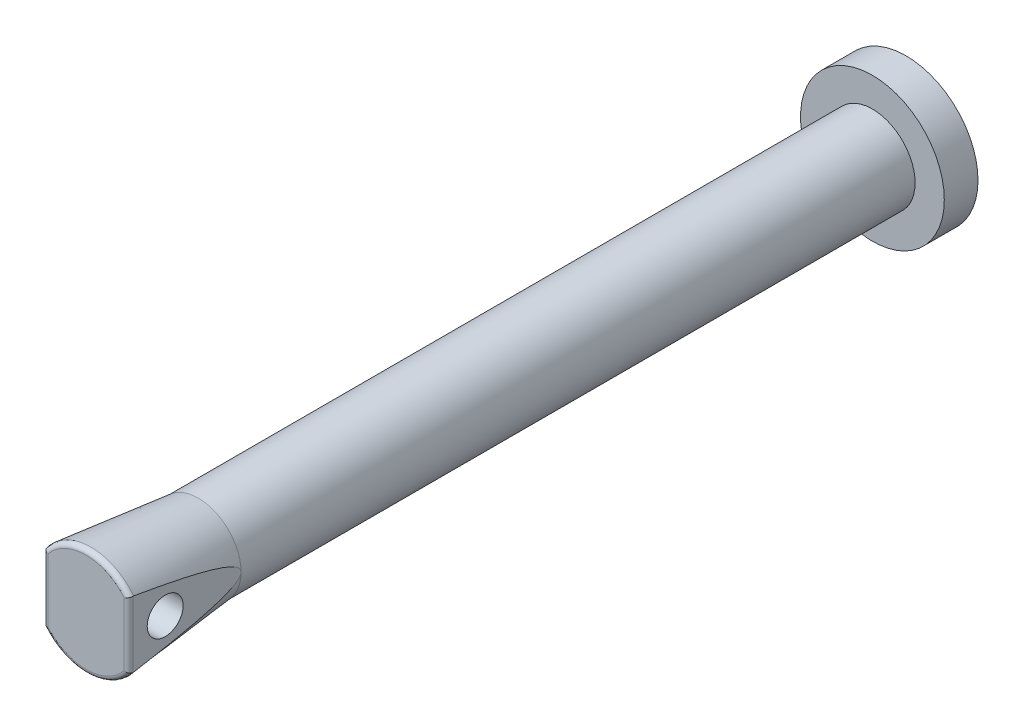
ISO-10303-21;
HEADER;
FILE_DESCRIPTION(('STEP AP214'),'2;1');
FILE_NAME('part.step','',(''),(''),'','','');
FILE_SCHEMA(('AUTOMOTIVE_DESIGN { 1 0 10303 214 1 1 1 1 }'));
ENDSEC;
DATA;
#1=APPLICATION_CONTEXT('core data for automotive mechanical design processes');
#2=APPLICATION_PROTOCOL_DEFINITION('international standard','automotive_design',2000,#1);
#3=PRODUCT_CONTEXT('',#1,'mechanical');
#4=PRODUCT('Part','Part','',(#3));
#5=PRODUCT_RELATED_PRODUCT_CATEGORY('part','',(#4));
#6=PRODUCT_DEFINITION_FORMATION('','',#4);
#7=PRODUCT_DEFINITION_CONTEXT('part definition',#1,'design');
#8=PRODUCT_DEFINITION('design','',#6,#7);
#9=PRODUCT_DEFINITION_SHAPE('','',#8);
#10=(LENGTH_UNIT() NAMED_UNIT(*) SI_UNIT(.MILLI.,.METRE.));
#11=(NAMED_UNIT(*) PLANE_ANGLE_UNIT() SI_UNIT($,.RADIAN.));
#12=(NAMED_UNIT(*) SI_UNIT($,.STERADIAN.) SOLID_ANGLE_UNIT());
#13=UNCERTAINTY_MEASURE_WITH_UNIT(LENGTH_MEASURE(1.E-05),#10,'distance_accuracy_value','');
#14=(GEOMETRIC_REPRESENTATION_CONTEXT(3) GLOBAL_UNCERTAINTY_ASSIGNED_CONTEXT((#13)) GLOBAL_UNIT_ASSIGNED_CONTEXT((#10,
#11,#12)) REPRESENTATION_CONTEXT('',''));
#15=CARTESIAN_POINT('',(0.,0.,0.));
#16=DIRECTION('',(0.,0.,1.));
#17=DIRECTION('',(1.,0.,0.));
#18=AXIS2_PLACEMENT_3D('',#15,#16,#17);
#19=CARTESIAN_POINT('',(0.,0.,31.5));
#20=DIRECTION('',(0.,0.,1.));
#21=DIRECTION('',(1.,0.,0.));
#22=AXIS2_PLACEMENT_3D('',#19,#20,#21);
#23=CONICAL_SURFACE('',#22,1.9,0.10471975511966);
#24=CARTESIAN_POINT('',(-1.9,-3.11871942863901,48.1682636303631));
#25=CARTESIAN_POINT('',(-1.9,-3.05199552113204,47.6262387212769));
#26=CARTESIAN_POINT('',(-1.9,-2.9847295043861,47.0842798156943));
#27=CARTESIAN_POINT('',(-1.9,-2.84872225674768,45.9999461155773));
#28=CARTESIAN_POINT('',(-1.9,-2.77997949506075,45.4575715132007));
#29=CARTESIAN_POINT('',(-1.9,-2.6395883321964,44.3638200670627));
#30=CARTESIAN_POINT('',(-1.9,-2.56791039762289,43.8124470010091));
#31=CARTESIAN_POINT('',(-1.9,-2.4587157489537,42.985905870376));
#32=CARTESIAN_POINT('',(-1.9,-2.42205777782612,42.7106243129805));
#33=CARTESIAN_POINT('',(-1.9,-2.34808758453786,42.1601584299603));
#34=CARTESIAN_POINT('',(-1.9,-2.31077538425534,41.884974101397));
#35=CARTESIAN_POINT('',(-1.9,-2.21830423472784,41.209923779676));
#36=CARTESIAN_POINT('',(-1.9,-2.1627261791933,40.8101150157795));
#37=CARTESIAN_POINT('',(-1.9,-2.04957036689844,40.0107199503034));
#38=CARTESIAN_POINT('',(-1.9,-1.99199231723345,39.611133690091));
#39=CARTESIAN_POINT('',(-1.9,-1.87405098289106,38.8108171818489));
#40=CARTESIAN_POINT('',(-1.9,-1.81367793482578,38.4100883655069));
#41=CARTESIAN_POINT('',(-1.9,-1.68951716964701,37.6093839514077));
#42=CARTESIAN_POINT('',(-1.9,-1.62573134878783,37.2094080606076));
#43=CARTESIAN_POINT('',(-1.9,-1.49429561733386,36.4158919732005));
#44=CARTESIAN_POINT('',(-1.9,-1.42671312912624,36.022340773442));
#45=CARTESIAN_POINT('',(-1.9,-1.31996870782234,35.4325595341474));
#46=CARTESIAN_POINT('',(-1.9,-1.28345119724393,35.2358517254585));
#47=CARTESIAN_POINT('',(-1.9,-1.20813677938724,34.8429135785833));
#48=CARTESIAN_POINT('',(-1.9,-1.16934036404403,34.6466831468034));
#49=CARTESIAN_POINT('',(-1.9,-1.08903711158749,34.2563864713236));
#50=CARTESIAN_POINT('',(-1.9,-1.04755403763767,34.0623153575148));
#51=CARTESIAN_POINT('',(-1.9,-0.960425295206531,33.6749271699646));
#52=CARTESIAN_POINT('',(-1.9,-0.914776319841149,33.4816108245335));
#53=CARTESIAN_POINT('',(-1.9,-0.841662424035123,33.1931693901792));
#54=CARTESIAN_POINT('',(-1.9,-0.816566075920704,33.0974453492903));
#55=CARTESIAN_POINT('',(-1.9,-0.764338955166364,32.9065564654745));
#56=CARTESIAN_POINT('',(-1.9,-0.737208355155407,32.8113915758348));
#57=CARTESIAN_POINT('',(-1.9,-0.680250350340743,32.6220022784074));
#58=CARTESIAN_POINT('',(-1.9,-0.650426456157276,32.5277768191317));
#59=CARTESIAN_POINT('',(-1.9,-0.58692715871387,32.3406432170821));
#60=CARTESIAN_POINT('',(-1.9,-0.553253780005188,32.2477344104804));
#61=CARTESIAN_POINT('',(-1.9,-0.502642883800662,32.1214621407745));
#62=CARTESIAN_POINT('',(-1.9,-0.488340722621905,32.0870451082748));
#63=CARTESIAN_POINT('',(-1.9,-0.458625374163171,32.0186726614223));
#64=CARTESIAN_POINT('',(-1.9,-0.443211721621327,31.9847174475353));
#65=CARTESIAN_POINT('',(-1.9,-0.410973415079732,31.917446089404));
#66=CARTESIAN_POINT('',(-1.9,-0.394147659166072,31.884130469639));
#67=CARTESIAN_POINT('',(-1.9,-0.358654172277566,31.8185013864491));
#68=CARTESIAN_POINT('',(-1.9,-0.339987635515699,31.7861872909366));
#69=CARTESIAN_POINT('',(-1.9,-0.299959903853907,31.7229183056353));
#70=CARTESIAN_POINT('',(-1.9,-0.278579289036246,31.6919756266233));
#71=CARTESIAN_POINT('',(-1.9,-0.232098541052787,31.6330462480839));
#72=CARTESIAN_POINT('',(-1.9,-0.20701883071336,31.6050446786243));
#73=CARTESIAN_POINT('',(-1.9,-0.168113022690874,31.5703331676783));
#74=CARTESIAN_POINT('',(-1.9,-0.156664542343544,31.5609951896857));
#75=CARTESIAN_POINT('',(-1.9,-0.132732926318115,31.5437001345682));
#76=CARTESIAN_POINT('',(-1.9,-0.120248967723396,31.5357441716006));
#77=CARTESIAN_POINT('',(-1.9,-0.0940155865727272,31.5216835909728));
#78=CARTESIAN_POINT('',(-1.9,-0.080250578528866,31.5156071711125));
#79=CARTESIAN_POINT('',(-1.9,-0.0518156228712424,31.5062210417516));
#80=CARTESIAN_POINT('',(-1.9,-0.0371487402112501,31.5029024635898));
#81=CARTESIAN_POINT('',(-1.9,-0.00899819528082644,31.4997603273636));
#82=CARTESIAN_POINT('',(-1.9,0.00444769925946513,31.499605932455));
#83=CARTESIAN_POINT('',(-1.9,0.0311056795354364,31.5019764740429));
#84=CARTESIAN_POINT('',(-1.9,0.0443175026790986,31.5045042471967));
#85=CARTESIAN_POINT('',(-1.9,0.0714178977281757,31.5122580512814));
#86=CARTESIAN_POINT('',(-1.9,0.0852307961527644,31.5177406337403));
#87=CARTESIAN_POINT('',(-1.9,0.111803744877239,31.5308283798571));
#88=CARTESIAN_POINT('',(-1.9,0.124561689320496,31.538437662231));
#89=CARTESIAN_POINT('',(-1.9,0.158078027134612,31.561327526229));
#90=CARTESIAN_POINT('',(-1.9,0.177784897655615,31.5781227702376));
#91=CARTESIAN_POINT('',(-1.9,0.214712832919976,31.6142248357892));
#92=CARTESIAN_POINT('',(-1.9,0.231925873518793,31.6335394005973));
#93=CARTESIAN_POINT('',(-1.9,0.27457367422364,31.6860798845341));
#94=CARTESIAN_POINT('',(-1.9,0.29849974880423,31.7205143846872));
#95=CARTESIAN_POINT('',(-1.9,0.343216753093194,31.7913901034176));
#96=CARTESIAN_POINT('',(-1.9,0.363999480956225,31.8278362442389));
#97=CARTESIAN_POINT('',(-1.9,0.403453763438799,31.9021383304044));
#98=CARTESIAN_POINT('',(-1.9,0.422111276392902,31.9400016774289));
#99=CARTESIAN_POINT('',(-1.9,0.457723984771087,32.0164478632713));
#100=CARTESIAN_POINT('',(-1.9,0.474681388569477,32.0550296894478));
#101=CARTESIAN_POINT('',(-1.9,0.529069996811893,32.1844457964586));
#102=CARTESIAN_POINT('',(-1.9,0.563698191835193,32.2764523393883));
#103=CARTESIAN_POINT('',(-1.9,0.628778792007014,32.4619439935406));
#104=CARTESIAN_POINT('',(-1.9,0.659228386586943,32.5554300532177));
#105=CARTESIAN_POINT('',(-1.9,0.71726972796229,32.7434952205437));
#106=CARTESIAN_POINT('',(-1.9,0.744855381115628,32.8380762014189));
#107=CARTESIAN_POINT('',(-1.9,0.797871964654658,33.0278431675882));
#108=CARTESIAN_POINT('',(-1.9,0.823302676528765,33.1230292131866));
#109=CARTESIAN_POINT('',(-1.9,0.897121120445496,33.4091878869942));
#110=CARTESIAN_POINT('',(-1.9,0.94304500047431,33.6007944039791));
#111=CARTESIAN_POINT('',(-1.9,1.03056620144799,33.9847038889798));
#112=CARTESIAN_POINT('',(-1.9,1.07216919068016,34.1770055931602));
#113=CARTESIAN_POINT('',(-1.9,1.15246889512094,34.5629712632855));
#114=CARTESIAN_POINT('',(-1.9,1.19115402201369,34.756637630663));
#115=CARTESIAN_POINT('',(-1.9,1.26620522427657,35.1444193339494));
#116=CARTESIAN_POINT('',(-1.9,1.30257125852264,35.3385346777568));
#117=CARTESIAN_POINT('',(-1.9,1.40898539289577,35.9214076135316));
#118=CARTESIAN_POINT('',(-1.9,1.47634217345639,36.3106556661479));
#119=CARTESIAN_POINT('',(-1.9,1.60639924291863,37.090339116177));
#120=CARTESIAN_POINT('',(-1.9,1.66909454284591,37.480775333103));
#121=CARTESIAN_POINT('',(-1.9,1.79107542842314,38.2621570615466));
#122=CARTESIAN_POINT('',(-1.9,1.85036119538053,38.6531025448504));
#123=CARTESIAN_POINT('',(-1.9,1.96498104153296,39.4259373100036));
#124=CARTESIAN_POINT('',(-1.9,2.02037594091081,39.8078176175345));
#125=CARTESIAN_POINT('',(-1.9,2.12926230223135,40.5718560360383));
#126=CARTESIAN_POINT('',(-1.9,2.18275372933622,40.9540141519654));
#127=CARTESIAN_POINT('',(-1.9,2.28812653865773,41.7179187233433));
#128=CARTESIAN_POINT('',(-1.9,2.34001039664258,42.0996648382037));
#129=CARTESIAN_POINT('',(-1.9,2.44251805613398,42.8633157500991));
#130=CARTESIAN_POINT('',(-1.9,2.49314189198259,43.2452205425203));
#131=CARTESIAN_POINT('',(-1.9,2.54326678488054,43.627189921935));
#132=B_SPLINE_CURVE_WITH_KNOTS('',3,(#24,#25,#26,#27,#28,#29,#30,#31,#32,#33,#34,#35,#36,#37,
#38,#39,#40,#41,#42,#43,#44,#45,#46,#47,#48,#49,#50,#51,#52,#53,#54,#55,#56,#57,#58,#59,#60,#61,
#62,#63,#64,#65,#66,#67,#68,#69,#70,#71,#72,#73,#74,#75,#76,#77,#78,#79,#80,#81,#82,#83,#84,#85,
#86,#87,#88,#89,#90,#91,#92,#93,#94,#95,#96,#97,#98,#99,#100,#101,#102,#103,#104,#105,#106,#107,
#108,#109,#110,#111,#112,#113,#114,#115,#116,#117,#118,#119,#120,#121,#122,#123,#124,#125,#126,
#127,#128,#129,#130,#131),.UNSPECIFIED.,.F.,.F.,(4,2,2,2,2,2,2,2,2,2,2,2,2,2,2,2,2,2,2,2,2,2,2,
2,2,2,2,2,2,2,2,2,2,2,2,2,2,2,2,2,2,2,2,2,2,2,2,2,2,2,2,2,2,4),(0.,1.63834983898015,
3.27848884592286,4.94652229689615,5.77965649232069,6.61276287974413,7.82371859948609,
9.03485242104581,10.2505941863027,11.4656673203169,12.6635527078085,13.2637493885935,
13.8638169808646,14.459156763116,15.0549733051862,15.351835607356,15.6486727458982,
15.945128402864,16.2414288566693,16.3532260000112,16.4650702155258,16.5770025332928,
16.6888627064188,16.80157388431,16.9136845859118,16.9579316177823,17.0022141569646,
17.0471319947798,17.0919048207446,17.1319693452254,17.1720762841644,17.2164148771624,
17.260839941604,17.3380806905843,17.4155646980542,17.5410264819922,17.6668101826068,
17.7933818883157,17.919786992236,18.2145016452952,18.5094135648529,18.8049406384019,
19.1004976427,19.6915073980375,20.2817317853395,20.8741887161147,21.4666561499058,
22.6517025305184,23.8379994822475,25.0242332922784,26.1818590368872,27.339505957763,
28.4952711413113,29.6510047897535),.UNSPECIFIED.);
#133=CARTESIAN_POINT('',(-1.9,0.,31.5));
#134=VERTEX_POINT('',#133);
#135=CARTESIAN_POINT('',(-1.9,1.47005440570894,36.2790943073464));
#136=VERTEX_POINT('',#135);
#137=EDGE_CURVE('E101',#134,#136,#132,.T.);
#138=ORIENTED_EDGE('',*,*,#137,.T.);
#139=CARTESIAN_POINT('',(0.,0.,36.2790943073465));
#140=DIRECTION('',(0.,0.,1.));
#141=DIRECTION('',(1.,0.,0.));
#142=AXIS2_PLACEMENT_3D('',#139,#140,#141);
#143=CIRCLE('',#142,2.4023030524362);
#144=CARTESIAN_POINT('',(1.9,1.4700544057136,36.2790943073736));
#145=VERTEX_POINT('',#144);
#146=EDGE_CURVE('E11',#136,#145,#143,.F.);
#147=ORIENTED_EDGE('',*,*,#146,.T.);
#148=CARTESIAN_POINT('',(1.9,-3.11871942863901,48.1682636303631));
#149=CARTESIAN_POINT('',(1.9,-3.05199552113204,47.6262387212769));
#150=CARTESIAN_POINT('',(1.9,-2.9847295043861,47.0842798156943));
#151=CARTESIAN_POINT('',(1.9,-2.84872225674768,45.9999461155773));
#152=CARTESIAN_POINT('',(1.9,-2.77997949506075,45.4575715132007));
#153=CARTESIAN_POINT('',(1.9,-2.6395883321964,44.3638200670627));
#154=CARTESIAN_POINT('',(1.9,-2.56791039762289,43.8124470010091));
#155=CARTESIAN_POINT('',(1.9,-2.4587157489537,42.985905870376));
#156=CARTESIAN_POINT('',(1.9,-2.42205777782612,42.7106243129805));
#157=CARTESIAN_POINT('',(1.9,-2.34808758453786,42.1601584299603));
#158=CARTESIAN_POINT('',(1.9,-2.31077538425534,41.884974101397));
#159=CARTESIAN_POINT('',(1.9,-2.21830423472784,41.209923779676));
#160=CARTESIAN_POINT('',(1.9,-2.1627261791933,40.8101150157795));
#161=CARTESIAN_POINT('',(1.9,-2.04957036689844,40.0107199503034));
#162=CARTESIAN_POINT('',(1.9,-1.99199231723345,39.611133690091));
#163=CARTESIAN_POINT('',(1.9,-1.87405098289106,38.8108171818489));
#164=CARTESIAN_POINT('',(1.9,-1.81367793482578,38.4100883655069));
#165=CARTESIAN_POINT('',(1.9,-1.68951716964701,37.6093839514077));
#166=CARTESIAN_POINT('',(1.9,-1.62573134878783,37.2094080606076));
#167=CARTESIAN_POINT('',(1.9,-1.49429561733386,36.4158919732005));
#168=CARTESIAN_POINT('',(1.9,-1.42671312912624,36.022340773442));
#169=CARTESIAN_POINT('',(1.9,-1.31996870782234,35.4325595341474));
#170=CARTESIAN_POINT('',(1.9,-1.28345119724393,35.2358517254585));
#171=CARTESIAN_POINT('',(1.9,-1.20813677938724,34.8429135785833));
#172=CARTESIAN_POINT('',(1.9,-1.16934036404403,34.6466831468034));
#173=CARTESIAN_POINT('',(1.9,-1.08903711158749,34.2563864713236));
#174=CARTESIAN_POINT('',(1.9,-1.04755403763767,34.0623153575148));
#175=CARTESIAN_POINT('',(1.9,-0.960425295206531,33.6749271699646));
#176=CARTESIAN_POINT('',(1.9,-0.914776319841149,33.4816108245335));
#177=CARTESIAN_POINT('',(1.9,-0.841662424035123,33.1931693901792));
#178=CARTESIAN_POINT('',(1.9,-0.816566075920704,33.0974453492903));
#179=CARTESIAN_POINT('',(1.9,-0.764338955166364,32.9065564654745));
#180=CARTESIAN_POINT('',(1.9,-0.737208355155407,32.8113915758348));
#181=CARTESIAN_POINT('',(1.9,-0.680250350340743,32.6220022784074));
#182=CARTESIAN_POINT('',(1.9,-0.650426456157276,32.5277768191317));
#183=CARTESIAN_POINT('',(1.9,-0.58692715871387,32.3406432170821));
#184=CARTESIAN_POINT('',(1.9,-0.553253780005188,32.2477344104804));
#185=CARTESIAN_POINT('',(1.9,-0.502642883800662,32.1214621407745));
#186=CARTESIAN_POINT('',(1.9,-0.488340722621905,32.0870451082748));
#187=CARTESIAN_POINT('',(1.9,-0.458625374163171,32.0186726614223));
#188=CARTESIAN_POINT('',(1.9,-0.443211721621327,31.9847174475353));
#189=CARTESIAN_POINT('',(1.9,-0.410973415079732,31.917446089404));
#190=CARTESIAN_POINT('',(1.9,-0.394147659166072,31.884130469639));
#191=CARTESIAN_POINT('',(1.9,-0.358654172277566,31.8185013864491));
#192=CARTESIAN_POINT('',(1.9,-0.339987635515699,31.7861872909366));
#193=CARTESIAN_POINT('',(1.9,-0.299959903853907,31.7229183056353));
#194=CARTESIAN_POINT('',(1.9,-0.278579289036246,31.6919756266233));
#195=CARTESIAN_POINT('',(1.9,-0.232098541052787,31.6330462480839));
#196=CARTESIAN_POINT('',(1.9,-0.20701883071336,31.6050446786243));
#197=CARTESIAN_POINT('',(1.9,-0.168113022690874,31.5703331676783));
#198=CARTESIAN_POINT('',(1.9,-0.156664542343544,31.5609951896857));
#199=CARTESIAN_POINT('',(1.9,-0.132732926318115,31.5437001345682));
#200=CARTESIAN_POINT('',(1.9,-0.120248967723396,31.5357441716006));
#201=CARTESIAN_POINT('',(1.9,-0.0940155865727272,31.5216835909728));
#202=CARTESIAN_POINT('',(1.9,-0.080250578528866,31.5156071711125));
#203=CARTESIAN_POINT('',(1.9,-0.0518156228712424,31.5062210417516));
#204=CARTESIAN_POINT('',(1.9,-0.0371487402112501,31.5029024635898));
#205=CARTESIAN_POINT('',(1.9,-0.00899819528082644,31.4997603273636));
#206=CARTESIAN_POINT('',(1.9,0.00444769925946513,31.499605932455));
#207=CARTESIAN_POINT('',(1.9,0.0311056795354364,31.5019764740429));
#208=CARTESIAN_POINT('',(1.9,0.0443175026790986,31.5045042471967));
#209=CARTESIAN_POINT('',(1.9,0.0714178977281757,31.5122580512814));
#210=CARTESIAN_POINT('',(1.9,0.0852307961527644,31.5177406337403));
#211=CARTESIAN_POINT('',(1.9,0.111803744877239,31.5308283798571));
#212=CARTESIAN_POINT('',(1.9,0.124561689320496,31.538437662231));
#213=CARTESIAN_POINT('',(1.9,0.158078027134612,31.561327526229));
#214=CARTESIAN_POINT('',(1.9,0.177784897655615,31.5781227702376));
#215=CARTESIAN_POINT('',(1.9,0.214712832919976,31.6142248357892));
#216=CARTESIAN_POINT('',(1.9,0.231925873518793,31.6335394005973));
#217=CARTESIAN_POINT('',(1.9,0.27457367422364,31.6860798845341));
#218=CARTESIAN_POINT('',(1.9,0.29849974880423,31.7205143846872));
#219=CARTESIAN_POINT('',(1.9,0.343216753093194,31.7913901034176));
#220=CARTESIAN_POINT('',(1.9,0.363999480956225,31.8278362442389));
#221=CARTESIAN_POINT('',(1.9,0.403453763438799,31.9021383304044));
#222=CARTESIAN_POINT('',(1.9,0.422111276392902,31.9400016774289));
#223=CARTESIAN_POINT('',(1.9,0.457723984771087,32.0164478632713));
#224=CARTESIAN_POINT('',(1.9,0.474681388569477,32.0550296894478));
#225=CARTESIAN_POINT('',(1.9,0.529069996811893,32.1844457964586));
#226=CARTESIAN_POINT('',(1.9,0.563698191835193,32.2764523393883));
#227=CARTESIAN_POINT('',(1.9,0.628778792007014,32.4619439935406));
#228=CARTESIAN_POINT('',(1.9,0.659228386586943,32.5554300532177));
#229=CARTESIAN_POINT('',(1.9,0.71726972796229,32.7434952205437));
#230=CARTESIAN_POINT('',(1.9,0.744855381115628,32.8380762014189));
#231=CARTESIAN_POINT('',(1.9,0.797871964654658,33.0278431675882));
#232=CARTESIAN_POINT('',(1.9,0.823302676528765,33.1230292131866));
#233=CARTESIAN_POINT('',(1.9,0.897121120445496,33.4091878869942));
#234=CARTESIAN_POINT('',(1.9,0.94304500047431,33.6007944039791));
#235=CARTESIAN_POINT('',(1.9,1.03056620144799,33.9847038889798));
#236=CARTESIAN_POINT('',(1.9,1.07216919068016,34.1770055931602));
#237=CARTESIAN_POINT('',(1.9,1.15246889512094,34.5629712632855));
#238=CARTESIAN_POINT('',(1.9,1.19115402201369,34.756637630663));
#239=CARTESIAN_POINT('',(1.9,1.26620522427657,35.1444193339494));
#240=CARTESIAN_POINT('',(1.9,1.30257125852264,35.3385346777568));
#241=CARTESIAN_POINT('',(1.9,1.40898539289577,35.9214076135316));
#242=CARTESIAN_POINT('',(1.9,1.47634217345639,36.3106556661479));
#243=CARTESIAN_POINT('',(1.9,1.60639924291863,37.090339116177));
#244=CARTESIAN_POINT('',(1.9,1.66909454284591,37.480775333103));
#245=CARTESIAN_POINT('',(1.9,1.79107542842314,38.2621570615466));
#246=CARTESIAN_POINT('',(1.9,1.85036119538053,38.6531025448504));
#247=CARTESIAN_POINT('',(1.9,1.96498104153296,39.4259373100036));
#248=CARTESIAN_POINT('',(1.9,2.02037594091081,39.8078176175345));
#249=CARTESIAN_POINT('',(1.9,2.12926230223135,40.5718560360383));
#250=CARTESIAN_POINT('',(1.9,2.18275372933622,40.9540141519654));
#251=CARTESIAN_POINT('',(1.9,2.28812653865773,41.7179187233433));
#252=CARTESIAN_POINT('',(1.9,2.34001039664258,42.0996648382037));
#253=CARTESIAN_POINT('',(1.9,2.44251805613398,42.8633157500991));
#254=CARTESIAN_POINT('',(1.9,2.49314189198259,43.2452205425203));
#255=CARTESIAN_POINT('',(1.9,2.54326678488054,43.627189921935));
#256=B_SPLINE_CURVE_WITH_KNOTS('',3,(#148,#149,#150,#151,#152,#153,#154,#155,#156,#157,#158,
#159,#160,#161,#162,#163,#164,#165,#166,#167,#168,#169,#170,#171,#172,#173,#174,#175,#176,#177,
#178,#179,#180,#181,#182,#183,#184,#185,#186,#187,#188,#189,#190,#191,#192,#193,#194,#195,#196,
#197,#198,#199,#200,#201,#202,#203,#204,#205,#206,#207,#208,#209,#210,#211,#212,#213,#214,#215,
#216,#217,#218,#219,#220,#221,#222,#223,#224,#225,#226,#227,#228,#229,#230,#231,#232,#233,#234,
#235,#236,#237,#238,#239,#240,#241,#242,#243,#244,#245,#246,#247,#248,#249,#250,#251,#252,#253,
#254,#255),.UNSPECIFIED.,.F.,.F.,(4,2,2,2,2,2,2,2,2,2,2,2,2,2,2,2,2,2,2,2,2,2,2,2,2,2,2,2,2,2,2,
2,2,2,2,2,2,2,2,2,2,2,2,2,2,2,2,2,2,2,2,2,2,4),(0.,1.63834983898015,3.27848884592286,
4.94652229689615,5.77965649232069,6.61276287974413,7.82371859948609,9.03485242104581,
10.2505941863027,11.4656673203169,12.6635527078085,13.2637493885935,13.8638169808646,
14.459156763116,15.0549733051862,15.351835607356,15.6486727458982,15.945128402864,
16.2414288566693,16.3532260000112,16.4650702155258,16.5770025332928,16.6888627064188,
16.80157388431,16.9136845859118,16.9579316177823,17.0022141569646,17.0471319947798,
17.0919048207446,17.1319693452254,17.1720762841644,17.2164148771624,17.260839941604,
17.3380806905843,17.4155646980542,17.5410264819922,17.6668101826068,17.7933818883157,
17.919786992236,18.2145016452952,18.5094135648529,18.8049406384019,19.1004976427,
19.6915073980375,20.2817317853395,20.8741887161147,21.4666561499058,22.6517025305184,
23.8379994822475,25.0242332922784,26.1818590368872,27.339505957763,28.4952711413113,
29.6510047897535),.UNSPECIFIED.);
#257=CARTESIAN_POINT('',(1.9,0.,31.5));
#258=VERTEX_POINT('',#257);
#259=EDGE_CURVE('E92',#145,#258,#256,.F.);
#260=ORIENTED_EDGE('',*,*,#259,.T.);
#261=CARTESIAN_POINT('',(0.,0.,31.5));
#262=DIRECTION('',(0.,0.,1.));
#263=DIRECTION('',(1.,0.,0.));
#264=AXIS2_PLACEMENT_3D('',#261,#262,#263);
#265=CIRCLE('',#264,1.9);
#266=EDGE_CURVE('E96',#258,#134,#265,.T.);
#267=ORIENTED_EDGE('',*,*,#266,.T.);
#268=EDGE_LOOP('',(#138,#147,#260,#267));
#269=FACE_BOUND('',#268,.T.);
#270=ADVANCED_FACE('F31',(#269),#23,.T.);
#271=CARTESIAN_POINT('',(0.,0.,1.5));
#272=DIRECTION('',(0.,0.,1.));
#273=DIRECTION('',(1.,0.,0.));
#274=AXIS2_PLACEMENT_3D('',#271,#272,#273);
#275=PLANE('',#274);
#276=CARTESIAN_POINT('',(0.,0.,1.5));
#277=DIRECTION('',(0.,0.,1.));
#278=DIRECTION('',(1.,0.,0.));
#279=AXIS2_PLACEMENT_3D('',#276,#277,#278);
#280=CIRCLE('',#279,3.2);
#281=CARTESIAN_POINT('',(3.2,0.,1.5));
#282=VERTEX_POINT('',#281);
#283=EDGE_CURVE('E124',#282,#282,#280,.T.);
#284=ORIENTED_EDGE('',*,*,#283,.T.);
#285=EDGE_LOOP('',(#284));
#286=FACE_BOUND('',#285,.T.);
#287=CARTESIAN_POINT('',(0.,0.,1.5));
#288=DIRECTION('',(0.,0.,1.));
#289=DIRECTION('',(1.,0.,0.));
#290=AXIS2_PLACEMENT_3D('',#287,#288,#289);
#291=CIRCLE('',#290,1.9);
#292=CARTESIAN_POINT('',(1.9,0.,1.5));
#293=VERTEX_POINT('',#292);
#294=EDGE_CURVE('E118',#293,#293,#291,.T.);
#295=ORIENTED_EDGE('',*,*,#294,.F.);
#296=EDGE_LOOP('',(#295));
#297=FACE_BOUND('',#296,.T.);
#298=ADVANCED_FACE('F220',(#286,#297),#275,.T.);
#299=CARTESIAN_POINT('',(0.,0.,1.5));
#300=DIRECTION('',(0.,0.,-1.));
#301=DIRECTION('',(-1.,0.,0.));
#302=AXIS2_PLACEMENT_3D('',#299,#300,#301);
#303=CYLINDRICAL_SURFACE('',#302,3.2);
#304=ORIENTED_EDGE('',*,*,#283,.F.);
#305=EDGE_LOOP('',(#304));
#306=FACE_BOUND('',#305,.T.);
#307=CARTESIAN_POINT('',(0.,0.,0.));
#308=DIRECTION('',(0.,0.,1.));
#309=DIRECTION('',(1.,0.,0.));
#310=AXIS2_PLACEMENT_3D('',#307,#308,#309);
#311=CIRCLE('',#310,3.2);
#312=CARTESIAN_POINT('',(3.2,0.,0.));
#313=VERTEX_POINT('',#312);
#314=EDGE_CURVE('E122',#313,#313,#311,.T.);
#315=ORIENTED_EDGE('',*,*,#314,.T.);
#316=EDGE_LOOP('',(#315));
#317=FACE_BOUND('',#316,.T.);
#318=ADVANCED_FACE('F185',(#306,#317),#303,.T.);
#319=CARTESIAN_POINT('',(0.,0.,0.));
#320=DIRECTION('',(0.,0.,1.));
#321=DIRECTION('',(1.,0.,0.));
#322=AXIS2_PLACEMENT_3D('',#319,#320,#321);
#323=PLANE('',#322);
#324=ORIENTED_EDGE('',*,*,#314,.F.);
#325=EDGE_LOOP('',(#324));
#326=FACE_BOUND('',#325,.T.);
#327=ADVANCED_FACE('F235',(#326),#323,.F.);
#328=CARTESIAN_POINT('',(0.,0.,31.5));
#329=DIRECTION('',(0.,0.,-1.));
#330=DIRECTION('',(-1.,0.,0.));
#331=AXIS2_PLACEMENT_3D('',#328,#329,#330);
#332=CYLINDRICAL_SURFACE('',#331,1.9);
#333=EDGE_CURVE('E117',#134,#258,#265,.T.);
#334=ORIENTED_EDGE('',*,*,#333,.F.);
#335=ORIENTED_EDGE('',*,*,#266,.F.);
#336=EDGE_LOOP('',(#334,#335));
#337=FACE_BOUND('',#336,.T.);
#338=ORIENTED_EDGE('',*,*,#294,.T.);
#339=EDGE_LOOP('',(#338));
#340=FACE_BOUND('',#339,.T.);
#341=ADVANCED_FACE('F115',(#337,#340),#332,.T.);
#342=CARTESIAN_POINT('',(1.9,-1.47005440570894,36.2790943073465));
#343=VERTEX_POINT('',#342);
#344=EDGE_CURVE('E102',#258,#343,#256,.F.);
#345=ORIENTED_EDGE('',*,*,#344,.T.);
#346=CARTESIAN_POINT('',(0.,0.,36.2790943073465));
#347=DIRECTION('',(0.,0.,1.));
#348=DIRECTION('',(1.,0.,0.));
#349=AXIS2_PLACEMENT_3D('',#346,#347,#348);
#350=CIRCLE('',#349,2.4023030524362);
#351=CARTESIAN_POINT('',(-1.9,-1.47005440570894,36.2790943073465));
#352=VERTEX_POINT('',#351);
#353=EDGE_CURVE('E176',#343,#352,#350,.F.);
#354=ORIENTED_EDGE('',*,*,#353,.T.);
#355=EDGE_CURVE('E121',#352,#134,#132,.T.);
#356=ORIENTED_EDGE('',*,*,#355,.T.);
#357=ORIENTED_EDGE('',*,*,#333,.T.);
#358=EDGE_LOOP('',(#345,#354,#356,#357));
#359=FACE_BOUND('',#358,.T.);
#360=ADVANCED_FACE('F120',(#359),#23,.T.);
#361=CARTESIAN_POINT('',(0.,0.,36.5));
#362=DIRECTION('',(0.,0.,1.));
#363=DIRECTION('',(1.,0.,0.));
#364=AXIS2_PLACEMENT_3D('',#361,#362,#363);
#365=PLANE('',#364);
#366=DIRECTION('',(0.,1.,0.));
#367=VECTOR('',#366,1.);
#368=CARTESIAN_POINT('',(-1.7,-1.50769790635174,36.5));
#369=LINE('',#368,#367);
#370=CARTESIAN_POINT('',(-1.7,1.40177234734311,36.5));
#371=VERTEX_POINT('',#370);
#372=CARTESIAN_POINT('',(-1.7,-1.40177234734311,36.5));
#373=VERTEX_POINT('',#372);
#374=EDGE_CURVE('E142',#371,#373,#369,.F.);
#375=ORIENTED_EDGE('',*,*,#374,.T.);
#376=CARTESIAN_POINT('',(0.,0.,36.5));
#377=DIRECTION('',(0.,0.,1.));
#378=DIRECTION('',(1.,0.,0.));
#379=AXIS2_PLACEMENT_3D('',#376,#377,#378);
#380=CIRCLE('',#379,2.20339867336254);
#381=CARTESIAN_POINT('',(1.7,-1.40177234734311,36.5));
#382=VERTEX_POINT('',#381);
#383=EDGE_CURVE('E146',#373,#382,#380,.T.);
#384=ORIENTED_EDGE('',*,*,#383,.T.);
#385=DIRECTION('',(0.,-1.,0.));
#386=VECTOR('',#385,1.);
#387=CARTESIAN_POINT('',(1.7,1.50769790635174,36.5));
#388=LINE('',#387,#386);
#389=CARTESIAN_POINT('',(1.7,1.40177234734311,36.5));
#390=VERTEX_POINT('',#389);
#391=EDGE_CURVE('E144',#382,#390,#388,.F.);
#392=ORIENTED_EDGE('',*,*,#391,.T.);
#393=CARTESIAN_POINT('',(0.,0.,36.5));
#394=DIRECTION('',(0.,0.,1.));
#395=DIRECTION('',(1.,0.,0.));
#396=AXIS2_PLACEMENT_3D('',#393,#394,#395);
#397=CIRCLE('',#396,2.20339867336254);
#398=EDGE_CURVE('E136',#390,#371,#397,.T.);
#399=ORIENTED_EDGE('',*,*,#398,.T.);
#400=EDGE_LOOP('',(#375,#384,#392,#399));
#401=FACE_BOUND('',#400,.T.);
#402=ADVANCED_FACE('F229',(#401),#365,.T.);
#403=CARTESIAN_POINT('',(-1.9,-17.5,31.5));
#404=DIRECTION('',(1.,0.,0.));
#405=DIRECTION('',(0.,0.,-1.));
#406=AXIS2_PLACEMENT_3D('',#403,#404,#405);
#407=PLANE('',#406);
#408=CARTESIAN_POINT('',(-1.9,0.,34.8772882157509));
#409=DIRECTION('',(-1.,0.,0.));
#410=DIRECTION('',(0.,0.,1.));
#411=AXIS2_PLACEMENT_3D('',#408,#409,#410);
#412=CIRCLE('',#411,0.800000000000003);
#413=CARTESIAN_POINT('',(-1.9,0.,35.6772882157509));
#414=VERTEX_POINT('',#413);
#415=EDGE_CURVE('E140',#414,#414,#412,.T.);
#416=ORIENTED_EDGE('',*,*,#415,.F.);
#417=EDGE_LOOP('',(#416));
#418=FACE_BOUND('',#417,.T.);
#419=ORIENTED_EDGE('',*,*,#355,.F.);
#420=CARTESIAN_POINT('',(-1.9,-1.47005440570894,36.2790943073465));
#421=CARTESIAN_POINT('',(-1.9,-1.47064950764922,36.2825531793297));
#422=CARTESIAN_POINT('',(-1.9,-1.47109620344566,36.2860247563741));
#423=CARTESIAN_POINT('',(-1.9,-1.47169278275144,36.2929933205918));
#424=CARTESIAN_POINT('',(-1.9,-1.4718426662602,36.2964903077653));
#425=CARTESIAN_POINT('',(-1.9,-1.47184414362453,36.2999999999999));
#426=B_SPLINE_CURVE_WITH_KNOTS('',3,(#420,#421,#422,#423,#424,#425),.UNSPECIFIED.,.F.,.F.,(4,2,
4),(0.,0.0105005932587167,0.0210011865380858),.UNSPECIFIED.);
#427=CARTESIAN_POINT('',(-1.9,-1.47184414362429,36.3));
#428=VERTEX_POINT('',#427);
#429=EDGE_CURVE('E44',#352,#428,#426,.T.);
#430=ORIENTED_EDGE('',*,*,#429,.T.);
#431=DIRECTION('',(0.,1.,0.));
#432=VECTOR('',#431,1.);
#433=CARTESIAN_POINT('',(-1.9,1.50769790635174,36.3));
#434=LINE('',#433,#432);
#435=CARTESIAN_POINT('',(-1.9,1.47184414362429,36.3));
#436=VERTEX_POINT('',#435);
#437=EDGE_CURVE('E55',#428,#436,#434,.T.);
#438=ORIENTED_EDGE('',*,*,#437,.T.);
#439=CARTESIAN_POINT('',(-1.9,1.47184414362429,36.3));
#440=CARTESIAN_POINT('',(-1.9,1.47184266626006,36.2964903077654));
#441=CARTESIAN_POINT('',(-1.9,1.47169278275138,36.2929933205919));
#442=CARTESIAN_POINT('',(-1.9,1.47109620344572,36.2860247563741));
#443=CARTESIAN_POINT('',(-1.9,1.47064950764932,36.2825531793297));
#444=CARTESIAN_POINT('',(-1.9,1.47005440570906,36.2790943073464));
#445=B_SPLINE_CURVE_WITH_KNOTS('',3,(#439,#440,#441,#442,#443,#444),.UNSPECIFIED.,.F.,.F.,(4,2,
4),(0.,0.0105005932793934,0.0210011865381293),.UNSPECIFIED.);
#446=EDGE_CURVE('E326',#436,#136,#445,.T.);
#447=ORIENTED_EDGE('',*,*,#446,.T.);
#448=ORIENTED_EDGE('',*,*,#137,.F.);
#449=EDGE_LOOP('',(#419,#430,#438,#447,#448));
#450=FACE_BOUND('',#449,.T.);
#451=ADVANCED_FACE('F161',(#418,#450),#407,.F.);
#452=CARTESIAN_POINT('',(1.9,-17.5,31.5));
#453=DIRECTION('',(-1.,0.,0.));
#454=DIRECTION('',(0.,0.,1.));
#455=AXIS2_PLACEMENT_3D('',#452,#453,#454);
#456=PLANE('',#455);
#457=CARTESIAN_POINT('',(1.9,0.,34.8772882157509));
#458=DIRECTION('',(-1.,0.,0.));
#459=DIRECTION('',(0.,0.,1.));
#460=AXIS2_PLACEMENT_3D('',#457,#458,#459);
#461=CIRCLE('',#460,0.800000000000003);
#462=CARTESIAN_POINT('',(1.9,0.,35.6772882157509));
#463=VERTEX_POINT('',#462);
#464=EDGE_CURVE('E112',#463,#463,#461,.T.);
#465=ORIENTED_EDGE('',*,*,#464,.T.);
#466=EDGE_LOOP('',(#465));
#467=FACE_BOUND('',#466,.T.);
#468=DIRECTION('',(0.,-1.,0.));
#469=VECTOR('',#468,1.);
#470=CARTESIAN_POINT('',(1.9,-1.50769790635174,36.3));
#471=LINE('',#470,#469);
#472=CARTESIAN_POINT('',(1.9,1.47184414362429,36.3));
#473=VERTEX_POINT('',#472);
#474=CARTESIAN_POINT('',(1.9,-1.47184414362429,36.3));
#475=VERTEX_POINT('',#474);
#476=EDGE_CURVE('E155',#473,#475,#471,.T.);
#477=ORIENTED_EDGE('',*,*,#476,.T.);
#478=CARTESIAN_POINT('',(1.9,-1.47184414362429,36.3));
#479=CARTESIAN_POINT('',(1.9,-1.47184266626006,36.2964903077654));
#480=CARTESIAN_POINT('',(1.9,-1.47169278275138,36.2929933205919));
#481=CARTESIAN_POINT('',(1.9,-1.47109620344572,36.2860247563741));
#482=CARTESIAN_POINT('',(1.9,-1.47064950764932,36.2825531793297));
#483=CARTESIAN_POINT('',(1.9,-1.47005440570907,36.2790943073465));
#484=B_SPLINE_CURVE_WITH_KNOTS('',3,(#478,#479,#480,#481,#482,#483),.UNSPECIFIED.,.F.,.F.,(4,2,
4),(0.,0.0105005932793795,0.0210011865381081),.UNSPECIFIED.);
#485=EDGE_CURVE('E107',#475,#343,#484,.T.);
#486=ORIENTED_EDGE('',*,*,#485,.T.);
#487=ORIENTED_EDGE('',*,*,#344,.F.);
#488=ORIENTED_EDGE('',*,*,#259,.F.);
#489=CARTESIAN_POINT('',(1.9,1.4700544057136,36.2790943073736));
#490=CARTESIAN_POINT('',(1.9,1.47064950765233,36.2825531793524));
#491=CARTESIAN_POINT('',(1.9,1.47109620344761,36.2860247563923));
#492=CARTESIAN_POINT('',(1.9,1.47169278275184,36.292993320601));
#493=CARTESIAN_POINT('',(1.9,1.47184266626021,36.2964903077699));
#494=CARTESIAN_POINT('',(1.9,1.47184414362453,36.3));
#495=B_SPLINE_CURVE_WITH_KNOTS('',3,(#489,#490,#491,#492,#493,#494),.UNSPECIFIED.,.F.,.F.,(4,2,
4),(0.,0.010500593244983,0.021001186510603),.UNSPECIFIED.);
#496=EDGE_CURVE('E149',#145,#473,#495,.T.);
#497=ORIENTED_EDGE('',*,*,#496,.T.);
#498=EDGE_LOOP('',(#477,#486,#487,#488,#497));
#499=FACE_BOUND('',#498,.T.);
#500=ADVANCED_FACE('F105',(#467,#499),#456,.F.);
#501=CARTESIAN_POINT('',(3.2,0.,34.8772882157509));
#502=DIRECTION('',(-1.,0.,0.));
#503=DIRECTION('',(0.,0.,1.));
#504=AXIS2_PLACEMENT_3D('',#501,#502,#503);
#505=CYLINDRICAL_SURFACE('',#504,0.800000000000003);
#506=ORIENTED_EDGE('',*,*,#415,.T.);
#507=EDGE_LOOP('',(#506));
#508=FACE_BOUND('',#507,.T.);
#509=ORIENTED_EDGE('',*,*,#464,.F.);
#510=EDGE_LOOP('',(#509));
#511=FACE_BOUND('',#510,.T.);
#512=ADVANCED_FACE('F160',(#508,#511),#505,.F.);
#513=CARTESIAN_POINT('',(0.,0.,36.3));
#514=DIRECTION('',(0.,0.,1.));
#515=DIRECTION('',(1.,0.,0.));
#516=AXIS2_PLACEMENT_3D('',#513,#514,#515);
#517=TOROIDAL_SURFACE('',#516,2.20339867336254,0.2);
#518=ORIENTED_EDGE('',*,*,#146,.F.);
#519=ORIENTED_EDGE('',*,*,#446,.F.);
#520=CARTESIAN_POINT('',(-1.9,1.47184414362429,36.3));
#521=CARTESIAN_POINT('',(-1.90001136896883,1.47184767250838,36.3108097602717));
#522=CARTESIAN_POINT('',(-1.89912438395928,1.4715446622834,36.3216132728193));
#523=CARTESIAN_POINT('',(-1.8956413858012,1.47035287425539,36.3428847350592));
#524=CARTESIAN_POINT('',(-1.89304909706878,1.46946537298727,36.3533533640128));
#525=CARTESIAN_POINT('',(-1.88624258877994,1.46713173608361,36.3736813439376));
#526=CARTESIAN_POINT('',(-1.8820284194225,1.46568561773788,36.3835407137552));
#527=CARTESIAN_POINT('',(-1.87212985233449,1.46228194904833,36.40239453986));
#528=CARTESIAN_POINT('',(-1.86644518672679,1.46032430552041,36.4113888381491));
#529=CARTESIAN_POINT('',(-1.85365165961073,1.45590753843871,36.4284820937366));
#530=CARTESIAN_POINT('',(-1.8465142647843,1.4534383466677,36.436557052627));
#531=CARTESIAN_POINT('',(-1.83111912904354,1.44809641680434,36.4514007544774));
#532=CARTESIAN_POINT('',(-1.8228609951284,1.44522353714135,36.4581690372095));
#533=CARTESIAN_POINT('',(-1.80501434090324,1.43899411163443,36.4705757380272));
#534=CARTESIAN_POINT('',(-1.79537935324882,1.43562033325611,36.4761385652851));
#535=CARTESIAN_POINT('',(-1.77540593912515,1.42859949307328,36.485569029206));
#536=CARTESIAN_POINT('',(-1.76506753734891,1.42495244086145,36.4894367253404));
#537=CARTESIAN_POINT('',(-1.74616233566178,1.4182561908905,36.4947937309731));
#538=CARTESIAN_POINT('',(-1.73767415179294,1.41524036317574,36.4966103607153));
#539=CARTESIAN_POINT('',(-1.72056878590163,1.40914284833961,36.4991266237069));
#540=CARTESIAN_POINT('',(-1.71195185890498,1.40606128728889,36.4998282290919));
#541=CARTESIAN_POINT('',(-1.70222496671594,1.40257119846718,36.4999907380987));
#542=CARTESIAN_POINT('',(-1.70111238087576,1.40217182231144,36.50000002334));
#543=CARTESIAN_POINT('',(-1.7,1.40177234734311,36.5));
#544=B_SPLINE_CURVE_WITH_KNOTS('',3,(#520,#521,#522,#523,#524,#525,#526,#527,#528,#529,#530,
#531,#532,#533,#534,#535,#536,#537,#538,#539,#540,#541,#542,#543),.UNSPECIFIED.,.F.,.F.,(4,2,2,
2,2,2,2,2,2,2,2,4),(0.,0.0323791277638335,0.0646877726288692,0.0969954175863507,
0.129308952107502,0.162332074193255,0.195366806304813,0.230092900587374,0.264817776455813,
0.292322231858244,0.319777985968021,0.323324210167647),.UNSPECIFIED.);
#545=EDGE_CURVE('E36',#371,#436,#544,.F.);
#546=ORIENTED_EDGE('',*,*,#545,.F.);
#547=ORIENTED_EDGE('',*,*,#398,.F.);
#548=CARTESIAN_POINT('',(1.9,1.47184414362429,36.3));
#549=CARTESIAN_POINT('',(1.90001136896883,1.47184767250838,36.3108097602717));
#550=CARTESIAN_POINT('',(1.89912438395928,1.4715446622834,36.3216132728193));
#551=CARTESIAN_POINT('',(1.8956413858012,1.47035287425539,36.3428847350592));
#552=CARTESIAN_POINT('',(1.89304909706878,1.46946537298727,36.3533533640128));
#553=CARTESIAN_POINT('',(1.88624258877994,1.46713173608361,36.3736813439376));
#554=CARTESIAN_POINT('',(1.8820284194225,1.46568561773788,36.3835407137552));
#555=CARTESIAN_POINT('',(1.87212985233449,1.46228194904833,36.40239453986));
#556=CARTESIAN_POINT('',(1.86644518672679,1.46032430552041,36.4113888381491));
#557=CARTESIAN_POINT('',(1.85365165961073,1.45590753843871,36.4284820937366));
#558=CARTESIAN_POINT('',(1.8465142647843,1.4534383466677,36.436557052627));
#559=CARTESIAN_POINT('',(1.83111912904354,1.44809641680434,36.4514007544774));
#560=CARTESIAN_POINT('',(1.8228609951284,1.44522353714135,36.4581690372095));
#561=CARTESIAN_POINT('',(1.80501434090324,1.43899411163443,36.4705757380272));
#562=CARTESIAN_POINT('',(1.79537935324882,1.43562033325611,36.4761385652851));
#563=CARTESIAN_POINT('',(1.77540593912515,1.42859949307328,36.485569029206));
#564=CARTESIAN_POINT('',(1.76506753734891,1.42495244086145,36.4894367253404));
#565=CARTESIAN_POINT('',(1.74616233566178,1.4182561908905,36.4947937309731));
#566=CARTESIAN_POINT('',(1.73767415179294,1.41524036317574,36.4966103607153));
#567=CARTESIAN_POINT('',(1.72056878590163,1.40914284833961,36.4991266237069));
#568=CARTESIAN_POINT('',(1.71195185890498,1.40606128728889,36.4998282290919));
#569=CARTESIAN_POINT('',(1.70222496671594,1.40257119846718,36.4999907380987));
#570=CARTESIAN_POINT('',(1.70111238087576,1.40217182231144,36.50000002334));
#571=CARTESIAN_POINT('',(1.7,1.40177234734311,36.5));
#572=B_SPLINE_CURVE_WITH_KNOTS('',3,(#548,#549,#550,#551,#552,#553,#554,#555,#556,#557,#558,
#559,#560,#561,#562,#563,#564,#565,#566,#567,#568,#569,#570,#571),.UNSPECIFIED.,.F.,.F.,(4,2,2,
2,2,2,2,2,2,2,2,4),(0.,0.0323791277638405,0.0646877726288691,0.0969954175863508,
0.129308952107502,0.162332074193256,0.195366806304813,0.230092900587374,0.264817776455813,
0.292322231858244,0.319777985968021,0.323324210167647),.UNSPECIFIED.);
#573=EDGE_CURVE('E203',#473,#390,#572,.T.);
#574=ORIENTED_EDGE('',*,*,#573,.F.);
#575=ORIENTED_EDGE('',*,*,#496,.F.);
#576=EDGE_LOOP('',(#518,#519,#546,#547,#574,#575));
#577=FACE_BOUND('',#576,.T.);
#578=ADVANCED_FACE('F33',(#577),#517,.T.);
#579=CARTESIAN_POINT('',(-1.7,-17.5,36.3));
#580=DIRECTION('',(0.,-1.,0.));
#581=DIRECTION('',(0.,0.,-1.));
#582=AXIS2_PLACEMENT_3D('',#579,#580,#581);
#583=CYLINDRICAL_SURFACE('',#582,0.2);
#584=ORIENTED_EDGE('',*,*,#545,.T.);
#585=ORIENTED_EDGE('',*,*,#437,.F.);
#586=CARTESIAN_POINT('',(-1.9,-1.47184414362429,36.3));
#587=CARTESIAN_POINT('',(-1.90001136896883,-1.47184767250838,36.3108097602717));
#588=CARTESIAN_POINT('',(-1.89912438395928,-1.4715446622834,36.3216132728193));
#589=CARTESIAN_POINT('',(-1.8956413858012,-1.47035287425539,36.3428847350592));
#590=CARTESIAN_POINT('',(-1.89304909706878,-1.46946537298727,36.3533533640128));
#591=CARTESIAN_POINT('',(-1.88624258877994,-1.46713173608361,36.3736813439376));
#592=CARTESIAN_POINT('',(-1.8820284194225,-1.46568561773788,36.3835407137552));
#593=CARTESIAN_POINT('',(-1.87212985233449,-1.46228194904833,36.40239453986));
#594=CARTESIAN_POINT('',(-1.86644518672679,-1.46032430552041,36.4113888381491));
#595=CARTESIAN_POINT('',(-1.85365165961073,-1.45590753843871,36.4284820937366));
#596=CARTESIAN_POINT('',(-1.8465142647843,-1.4534383466677,36.436557052627));
#597=CARTESIAN_POINT('',(-1.83111912904354,-1.44809641680434,36.4514007544774));
#598=CARTESIAN_POINT('',(-1.8228609951284,-1.44522353714135,36.4581690372095));
#599=CARTESIAN_POINT('',(-1.80501434090324,-1.43899411163443,36.4705757380272));
#600=CARTESIAN_POINT('',(-1.79537935324882,-1.43562033325611,36.4761385652851));
#601=CARTESIAN_POINT('',(-1.77540593912515,-1.42859949307328,36.485569029206));
#602=CARTESIAN_POINT('',(-1.76506753734891,-1.42495244086145,36.4894367253404));
#603=CARTESIAN_POINT('',(-1.74616233566178,-1.4182561908905,36.4947937309731));
#604=CARTESIAN_POINT('',(-1.73767415179294,-1.41524036317574,36.4966103607153));
#605=CARTESIAN_POINT('',(-1.72056878590163,-1.40914284833961,36.4991266237069));
#606=CARTESIAN_POINT('',(-1.71195185890498,-1.40606128728889,36.4998282290919));
#607=CARTESIAN_POINT('',(-1.70222496671594,-1.40257119846718,36.4999907380987));
#608=CARTESIAN_POINT('',(-1.70111238087576,-1.40217182231144,36.50000002334));
#609=CARTESIAN_POINT('',(-1.7,-1.40177234734311,36.5));
#610=B_SPLINE_CURVE_WITH_KNOTS('',3,(#586,#587,#588,#589,#590,#591,#592,#593,#594,#595,#596,
#597,#598,#599,#600,#601,#602,#603,#604,#605,#606,#607,#608,#609),.UNSPECIFIED.,.F.,.F.,(4,2,2,
2,2,2,2,2,2,2,2,4),(0.,0.0323791277638335,0.0646877726288691,0.0969954175863507,
0.129308952107502,0.162332074193256,0.195366806304813,0.230092900587374,0.264817776455813,
0.292322231858244,0.319777985968021,0.323324210167647),.UNSPECIFIED.);
#611=EDGE_CURVE('E198',#373,#428,#610,.F.);
#612=ORIENTED_EDGE('',*,*,#611,.F.);
#613=ORIENTED_EDGE('',*,*,#374,.F.);
#614=EDGE_LOOP('',(#584,#585,#612,#613));
#615=FACE_BOUND('',#614,.T.);
#616=ADVANCED_FACE('F207',(#615),#583,.T.);
#617=CARTESIAN_POINT('',(1.7,-17.5,36.3));
#618=DIRECTION('',(0.,1.,0.));
#619=DIRECTION('',(0.,0.,1.));
#620=AXIS2_PLACEMENT_3D('',#617,#618,#619);
#621=CYLINDRICAL_SURFACE('',#620,0.2);
#622=ORIENTED_EDGE('',*,*,#573,.T.);
#623=ORIENTED_EDGE('',*,*,#391,.F.);
#624=CARTESIAN_POINT('',(1.9,-1.47184414362429,36.3));
#625=CARTESIAN_POINT('',(1.90001136896883,-1.47184767250838,36.3108097602717));
#626=CARTESIAN_POINT('',(1.89912438395928,-1.4715446622834,36.3216132728193));
#627=CARTESIAN_POINT('',(1.8956413858012,-1.47035287425539,36.3428847350592));
#628=CARTESIAN_POINT('',(1.89304909706878,-1.46946537298727,36.3533533640128));
#629=CARTESIAN_POINT('',(1.88624258877994,-1.46713173608361,36.3736813439376));
#630=CARTESIAN_POINT('',(1.8820284194225,-1.46568561773788,36.3835407137552));
#631=CARTESIAN_POINT('',(1.87212985233449,-1.46228194904833,36.40239453986));
#632=CARTESIAN_POINT('',(1.86644518672679,-1.46032430552041,36.4113888381491));
#633=CARTESIAN_POINT('',(1.85365165961073,-1.45590753843871,36.4284820937366));
#634=CARTESIAN_POINT('',(1.8465142647843,-1.4534383466677,36.436557052627));
#635=CARTESIAN_POINT('',(1.83111912904354,-1.44809641680434,36.4514007544774));
#636=CARTESIAN_POINT('',(1.8228609951284,-1.44522353714135,36.4581690372095));
#637=CARTESIAN_POINT('',(1.80501434090324,-1.43899411163443,36.4705757380272));
#638=CARTESIAN_POINT('',(1.79537935324882,-1.43562033325611,36.4761385652851));
#639=CARTESIAN_POINT('',(1.77540593912515,-1.42859949307328,36.485569029206));
#640=CARTESIAN_POINT('',(1.76506753734891,-1.42495244086145,36.4894367253404));
#641=CARTESIAN_POINT('',(1.74616233566178,-1.4182561908905,36.4947937309731));
#642=CARTESIAN_POINT('',(1.73767415179294,-1.41524036317574,36.4966103607153));
#643=CARTESIAN_POINT('',(1.72056878590163,-1.40914284833961,36.4991266237069));
#644=CARTESIAN_POINT('',(1.71195185890498,-1.40606128728889,36.4998282290919));
#645=CARTESIAN_POINT('',(1.70222496671594,-1.40257119846718,36.4999907380987));
#646=CARTESIAN_POINT('',(1.70111238087576,-1.40217182231144,36.50000002334));
#647=CARTESIAN_POINT('',(1.7,-1.40177234734311,36.5));
#648=B_SPLINE_CURVE_WITH_KNOTS('',3,(#624,#625,#626,#627,#628,#629,#630,#631,#632,#633,#634,
#635,#636,#637,#638,#639,#640,#641,#642,#643,#644,#645,#646,#647),.UNSPECIFIED.,.F.,.F.,(4,2,2,
2,2,2,2,2,2,2,2,4),(0.,0.0323791277638335,0.0646877726288691,0.0969954175863507,
0.129308952107502,0.162332074193256,0.195366806304813,0.230092900587374,0.264817776455813,
0.292322231858244,0.319777985968021,0.323324210167647),.UNSPECIFIED.);
#649=EDGE_CURVE('E191',#475,#382,#648,.T.);
#650=ORIENTED_EDGE('',*,*,#649,.F.);
#651=ORIENTED_EDGE('',*,*,#476,.F.);
#652=EDGE_LOOP('',(#622,#623,#650,#651));
#653=FACE_BOUND('',#652,.T.);
#654=ADVANCED_FACE('F183',(#653),#621,.T.);
#655=CARTESIAN_POINT('',(0.,0.,36.3));
#656=DIRECTION('',(0.,0.,1.));
#657=DIRECTION('',(1.,0.,0.));
#658=AXIS2_PLACEMENT_3D('',#655,#656,#657);
#659=TOROIDAL_SURFACE('',#658,2.20339867336254,0.2);
#660=ORIENTED_EDGE('',*,*,#429,.F.);
#661=ORIENTED_EDGE('',*,*,#353,.F.);
#662=ORIENTED_EDGE('',*,*,#485,.F.);
#663=ORIENTED_EDGE('',*,*,#649,.T.);
#664=ORIENTED_EDGE('',*,*,#383,.F.);
#665=ORIENTED_EDGE('',*,*,#611,.T.);
#666=EDGE_LOOP('',(#660,#661,#662,#663,#664,#665));
#667=FACE_BOUND('',#666,.T.);
#668=ADVANCED_FACE('F178',(#667),#659,.T.);
#669=CLOSED_SHELL('',(#270,#298,#318,#327,#341,#360,#402,#451,#500,#512,#578,#616,#654,#668));
#670=MANIFOLD_SOLID_BREP('B2',#669);
#671=ADVANCED_BREP_SHAPE_REPRESENTATION('',(#18,#670),#14);
#672=SHAPE_DEFINITION_REPRESENTATION(#9,#671);
ENDSEC;
END-ISO-10303-21;
